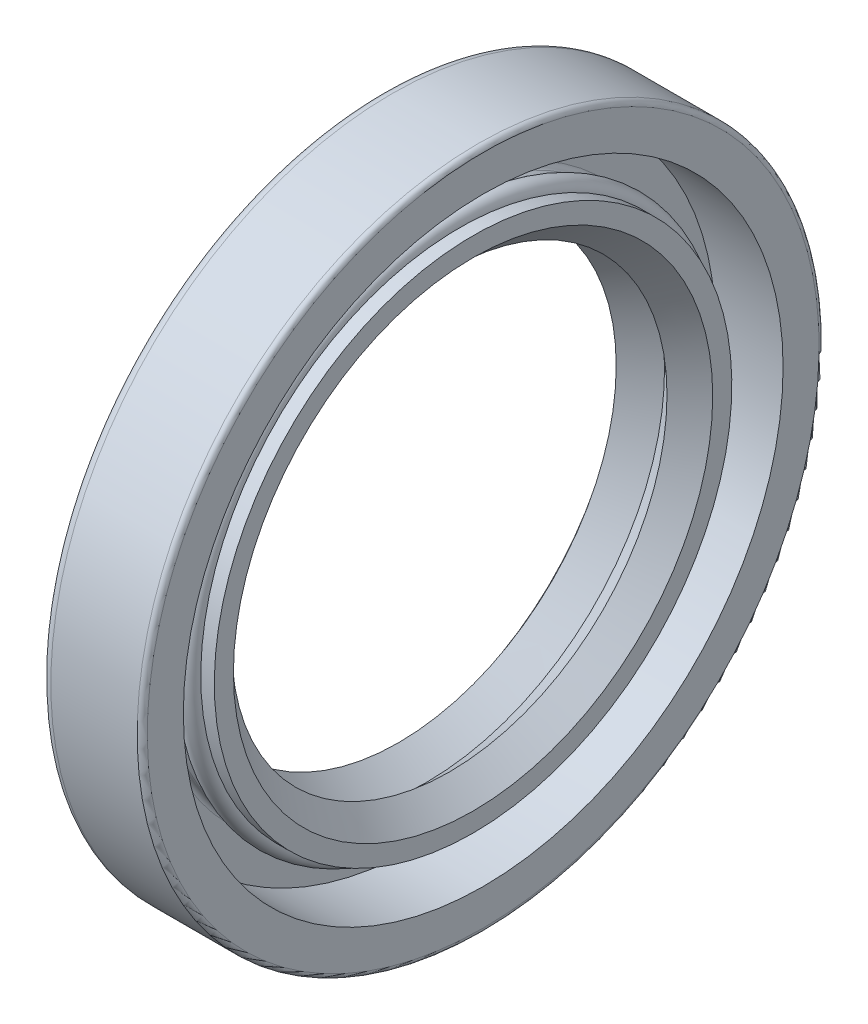
ISO-10303-21;
HEADER;
FILE_DESCRIPTION(('STEP AP214'),'2;1');
FILE_NAME('part.step','',(''),(''),'','','');
FILE_SCHEMA(('AUTOMOTIVE_DESIGN { 1 0 10303 214 1 1 1 1 }'));
ENDSEC;
DATA;
#1=APPLICATION_CONTEXT('core data for automotive mechanical design processes');
#2=APPLICATION_PROTOCOL_DEFINITION('international standard','automotive_design',2000,#1);
#3=PRODUCT_CONTEXT('',#1,'mechanical');
#4=PRODUCT('Part','Part','',(#3));
#5=PRODUCT_RELATED_PRODUCT_CATEGORY('part','',(#4));
#6=PRODUCT_DEFINITION_FORMATION('','',#4);
#7=PRODUCT_DEFINITION_CONTEXT('part definition',#1,'design');
#8=PRODUCT_DEFINITION('design','',#6,#7);
#9=PRODUCT_DEFINITION_SHAPE('','',#8);
#10=(LENGTH_UNIT() NAMED_UNIT(*) SI_UNIT(.MILLI.,.METRE.));
#11=(NAMED_UNIT(*) PLANE_ANGLE_UNIT() SI_UNIT($,.RADIAN.));
#12=(NAMED_UNIT(*) SI_UNIT($,.STERADIAN.) SOLID_ANGLE_UNIT());
#13=UNCERTAINTY_MEASURE_WITH_UNIT(LENGTH_MEASURE(1.E-05),#10,'distance_accuracy_value','');
#14=(GEOMETRIC_REPRESENTATION_CONTEXT(3) GLOBAL_UNCERTAINTY_ASSIGNED_CONTEXT((#13)) GLOBAL_UNIT_ASSIGNED_CONTEXT((#10,
#11,#12)) REPRESENTATION_CONTEXT('',''));
#15=CARTESIAN_POINT('',(0.,0.,0.));
#16=DIRECTION('',(0.,0.,1.));
#17=DIRECTION('',(1.,0.,0.));
#18=AXIS2_PLACEMENT_3D('',#15,#16,#17);
#19=CARTESIAN_POINT('',(4.66666666666667,0.,0.));
#20=DIRECTION('',(-1.,0.,0.));
#21=DIRECTION('',(0.,0.,1.));
#22=AXIS2_PLACEMENT_3D('',#19,#20,#21);
#23=TOROIDAL_SURFACE('',#22,17.8333333333333,0.699999999999999);
#24=CARTESIAN_POINT('',(4.66666666666667,0.,18.5333333333333));
#25=VERTEX_POINT('',#24);
#26=VERTEX_LOOP('',#25);
#27=FACE_BOUND('',#26,.T.);
#28=ADVANCED_FACE('F47',(#27),#23,.T.);
#29=CLOSED_SHELL('',(#28));
#30=MANIFOLD_SOLID_BREP('B2',#29);
#31=CARTESIAN_POINT('',(0.,22.8,0.));
#32=DIRECTION('',(1.,0.,0.));
#33=DIRECTION('',(0.,1.,0.));
#34=AXIS2_PLACEMENT_3D('',#31,#32,#33);
#35=PLANE('',#34);
#36=CARTESIAN_POINT('',(0.,0.,0.));
#37=DIRECTION('',(-1.,0.,0.));
#38=DIRECTION('',(0.,-1.,0.));
#39=AXIS2_PLACEMENT_3D('',#36,#37,#38);
#40=CIRCLE('',#39,20.6666666666667);
#41=CARTESIAN_POINT('',(0.,-20.6666666666667,0.));
#42=VERTEX_POINT('',#41);
#43=EDGE_CURVE('E46',#42,#42,#40,.T.);
#44=ORIENTED_EDGE('',*,*,#43,.F.);
#45=EDGE_LOOP('',(#44));
#46=FACE_BOUND('',#45,.T.);
#47=CARTESIAN_POINT('',(0.,0.,0.));
#48=DIRECTION('',(-1.,0.,0.));
#49=DIRECTION('',(0.,-1.,0.));
#50=AXIS2_PLACEMENT_3D('',#47,#48,#49);
#51=CIRCLE('',#50,22.8);
#52=CARTESIAN_POINT('',(0.,-22.8,0.));
#53=VERTEX_POINT('',#52);
#54=EDGE_CURVE('E153',#53,#53,#51,.T.);
#55=ORIENTED_EDGE('',*,*,#54,.T.);
#56=EDGE_LOOP('',(#55));
#57=FACE_BOUND('',#56,.T.);
#58=ADVANCED_FACE('F60',(#46,#57),#35,.F.);
#59=CARTESIAN_POINT('',(7.,0.,0.));
#60=DIRECTION('',(-1.,0.,0.));
#61=DIRECTION('',(0.,-1.,0.));
#62=AXIS2_PLACEMENT_3D('',#59,#60,#61);
#63=CYLINDRICAL_SURFACE('',#62,20.6666666666667);
#64=CARTESIAN_POINT('',(0.21875,0.,0.));
#65=DIRECTION('',(-1.,0.,0.));
#66=DIRECTION('',(0.,-1.,0.));
#67=AXIS2_PLACEMENT_3D('',#64,#65,#66);
#68=CIRCLE('',#67,20.6666666666667);
#69=CARTESIAN_POINT('',(0.21875,-20.6666666666667,0.));
#70=VERTEX_POINT('',#69);
#71=EDGE_CURVE('E67',#70,#70,#68,.T.);
#72=ORIENTED_EDGE('',*,*,#71,.F.);
#73=EDGE_LOOP('',(#72));
#74=FACE_BOUND('',#73,.T.);
#75=ORIENTED_EDGE('',*,*,#43,.T.);
#76=EDGE_LOOP('',(#75));
#77=FACE_BOUND('',#76,.T.);
#78=ADVANCED_FACE('F276',(#74,#77),#63,.F.);
#79=CARTESIAN_POINT('',(0.21875,20.6666666666667,0.));
#80=DIRECTION('',(1.,0.,0.));
#81=DIRECTION('',(0.,1.,0.));
#82=AXIS2_PLACEMENT_3D('',#79,#80,#81);
#83=PLANE('',#82);
#84=CARTESIAN_POINT('',(0.21875,0.,0.));
#85=DIRECTION('',(-1.,0.,0.));
#86=DIRECTION('',(0.,-1.,0.));
#87=AXIS2_PLACEMENT_3D('',#84,#85,#86);
#88=CIRCLE('',#87,17.8333333333333);
#89=CARTESIAN_POINT('',(0.21875,-17.8333333333333,0.));
#90=VERTEX_POINT('',#89);
#91=EDGE_CURVE('E73',#90,#90,#88,.T.);
#92=ORIENTED_EDGE('',*,*,#91,.F.);
#93=EDGE_LOOP('',(#92));
#94=FACE_BOUND('',#93,.T.);
#95=ORIENTED_EDGE('',*,*,#71,.T.);
#96=EDGE_LOOP('',(#95));
#97=FACE_BOUND('',#96,.T.);
#98=ADVANCED_FACE('F271',(#94,#97),#83,.F.);
#99=CARTESIAN_POINT('',(7.,0.,0.));
#100=DIRECTION('',(-1.,0.,0.));
#101=DIRECTION('',(0.,-1.,0.));
#102=AXIS2_PLACEMENT_3D('',#99,#100,#101);
#103=CYLINDRICAL_SURFACE('',#102,17.8333333333333);
#104=CARTESIAN_POINT('',(0.,0.,0.));
#105=DIRECTION('',(-1.,0.,0.));
#106=DIRECTION('',(0.,-1.,0.));
#107=AXIS2_PLACEMENT_3D('',#104,#105,#106);
#108=CIRCLE('',#107,17.8333333333333);
#109=CARTESIAN_POINT('',(0.,-17.8333333333333,0.));
#110=VERTEX_POINT('',#109);
#111=EDGE_CURVE('E79',#110,#110,#108,.T.);
#112=ORIENTED_EDGE('',*,*,#111,.F.);
#113=EDGE_LOOP('',(#112));
#114=FACE_BOUND('',#113,.T.);
#115=ORIENTED_EDGE('',*,*,#91,.T.);
#116=EDGE_LOOP('',(#115));
#117=FACE_BOUND('',#116,.T.);
#118=ADVANCED_FACE('F265',(#114,#117),#103,.T.);
#119=CARTESIAN_POINT('',(0.,17.8333333333333,0.));
#120=DIRECTION('',(1.,0.,0.));
#121=DIRECTION('',(0.,1.,0.));
#122=AXIS2_PLACEMENT_3D('',#119,#120,#121);
#123=PLANE('',#122);
#124=CARTESIAN_POINT('',(0.,0.,0.));
#125=DIRECTION('',(-1.,0.,0.));
#126=DIRECTION('',(0.,-1.,0.));
#127=AXIS2_PLACEMENT_3D('',#124,#125,#126);
#128=CIRCLE('',#127,17.125);
#129=CARTESIAN_POINT('',(0.,-17.125,0.));
#130=VERTEX_POINT('',#129);
#131=EDGE_CURVE('E85',#130,#130,#128,.T.);
#132=ORIENTED_EDGE('',*,*,#131,.F.);
#133=EDGE_LOOP('',(#132));
#134=FACE_BOUND('',#133,.T.);
#135=ORIENTED_EDGE('',*,*,#111,.T.);
#136=EDGE_LOOP('',(#135));
#137=FACE_BOUND('',#136,.T.);
#138=ADVANCED_FACE('F259',(#134,#137),#123,.F.);
#139=CARTESIAN_POINT('',(0.,0.,0.));
#140=DIRECTION('',(-1.,0.,0.));
#141=DIRECTION('',(0.,-1.,0.));
#142=AXIS2_PLACEMENT_3D('',#139,#140,#141);
#143=CONICAL_SURFACE('',#142,17.125,0.545655054526993);
#144=CARTESIAN_POINT('',(1.16666666666667,0.,0.));
#145=DIRECTION('',(-1.,0.,0.));
#146=DIRECTION('',(0.,-1.,0.));
#147=AXIS2_PLACEMENT_3D('',#144,#145,#146);
#148=CIRCLE('',#147,16.4166666666667);
#149=CARTESIAN_POINT('',(1.16666666666667,-16.4166666666667,0.));
#150=VERTEX_POINT('',#149);
#151=EDGE_CURVE('E89',#150,#150,#148,.T.);
#152=ORIENTED_EDGE('',*,*,#151,.F.);
#153=EDGE_LOOP('',(#152));
#154=FACE_BOUND('',#153,.T.);
#155=ORIENTED_EDGE('',*,*,#131,.T.);
#156=EDGE_LOOP('',(#155));
#157=FACE_BOUND('',#156,.T.);
#158=ADVANCED_FACE('F253',(#154,#157),#143,.F.);
#159=CARTESIAN_POINT('',(1.16666666666667,0.,0.));
#160=DIRECTION('',(1.,0.,0.));
#161=DIRECTION('',(0.,1.,0.));
#162=AXIS2_PLACEMENT_3D('',#159,#160,#161);
#163=CONICAL_SURFACE('',#162,16.4166666666667,0.637393208145611);
#164=CARTESIAN_POINT('',(0.489140143141471,0.,0.));
#165=DIRECTION('',(-1.,0.,0.));
#166=DIRECTION('',(0.,-1.,0.));
#167=AXIS2_PLACEMENT_3D('',#164,#165,#166);
#168=CIRCLE('',#167,15.914958406911);
#169=CARTESIAN_POINT('',(0.489140143141471,-15.914958406911,0.));
#170=VERTEX_POINT('',#169);
#171=EDGE_CURVE('E93',#170,#170,#168,.T.);
#172=ORIENTED_EDGE('',*,*,#171,.F.);
#173=EDGE_LOOP('',(#172));
#174=FACE_BOUND('',#173,.T.);
#175=ORIENTED_EDGE('',*,*,#151,.T.);
#176=EDGE_LOOP('',(#175));
#177=FACE_BOUND('',#176,.T.);
#178=ADVANCED_FACE('F247',(#174,#177),#163,.T.);
#179=CARTESIAN_POINT('',(0.489140143141471,0.,0.));
#180=DIRECTION('',(-1.,0.,0.));
#181=DIRECTION('',(0.,-1.,0.));
#182=AXIS2_PLACEMENT_3D('',#179,#180,#181);
#183=CONICAL_SURFACE('',#182,15.914958406911,0.933403118649285);
#184=CARTESIAN_POINT('',(1.16666666666667,0.,0.));
#185=DIRECTION('',(-1.,0.,0.));
#186=DIRECTION('',(0.,-1.,0.));
#187=AXIS2_PLACEMENT_3D('',#184,#185,#186);
#188=CIRCLE('',#187,15.);
#189=CARTESIAN_POINT('',(1.16666666666667,-15.,0.));
#190=VERTEX_POINT('',#189);
#191=EDGE_CURVE('E97',#190,#190,#188,.T.);
#192=ORIENTED_EDGE('',*,*,#191,.F.);
#193=EDGE_LOOP('',(#192));
#194=FACE_BOUND('',#193,.T.);
#195=ORIENTED_EDGE('',*,*,#171,.T.);
#196=EDGE_LOOP('',(#195));
#197=FACE_BOUND('',#196,.T.);
#198=ADVANCED_FACE('F241',(#194,#197),#183,.F.);
#199=CARTESIAN_POINT('',(1.16666666666667,0.,0.));
#200=DIRECTION('',(1.,0.,0.));
#201=DIRECTION('',(0.,1.,0.));
#202=AXIS2_PLACEMENT_3D('',#199,#200,#201);
#203=CONICAL_SURFACE('',#202,15.,0.637393208145611);
#204=CARTESIAN_POINT('',(3.07978893044627,0.,0.));
#205=DIRECTION('',(-1.,0.,0.));
#206=DIRECTION('',(0.,-1.,0.));
#207=AXIS2_PLACEMENT_3D('',#204,#205,#206);
#208=CIRCLE('',#207,16.4166666666667);
#209=CARTESIAN_POINT('',(3.07978893044627,-16.4166666666667,0.));
#210=VERTEX_POINT('',#209);
#211=EDGE_CURVE('E101',#210,#210,#208,.T.);
#212=ORIENTED_EDGE('',*,*,#211,.F.);
#213=EDGE_LOOP('',(#212));
#214=FACE_BOUND('',#213,.T.);
#215=ORIENTED_EDGE('',*,*,#191,.T.);
#216=EDGE_LOOP('',(#215));
#217=FACE_BOUND('',#216,.T.);
#218=ADVANCED_FACE('F235',(#214,#217),#203,.F.);
#219=CARTESIAN_POINT('',(3.07978893044627,0.,0.));
#220=DIRECTION('',(-1.,0.,0.));
#221=DIRECTION('',(0.,-1.,0.));
#222=AXIS2_PLACEMENT_3D('',#219,#220,#221);
#223=CONICAL_SURFACE('',#222,16.4166666666667,0.728788642685038);
#224=CARTESIAN_POINT('',(4.66666666666667,0.,0.));
#225=DIRECTION('',(-1.,0.,0.));
#226=DIRECTION('',(0.,-1.,0.));
#227=AXIS2_PLACEMENT_3D('',#224,#225,#226);
#228=CIRCLE('',#227,15.);
#229=CARTESIAN_POINT('',(4.66666666666667,-15.,0.));
#230=VERTEX_POINT('',#229);
#231=EDGE_CURVE('E105',#230,#230,#228,.T.);
#232=ORIENTED_EDGE('',*,*,#231,.F.);
#233=EDGE_LOOP('',(#232));
#234=FACE_BOUND('',#233,.T.);
#235=ORIENTED_EDGE('',*,*,#211,.T.);
#236=EDGE_LOOP('',(#235));
#237=FACE_BOUND('',#236,.T.);
#238=ADVANCED_FACE('F229',(#234,#237),#223,.F.);
#239=CARTESIAN_POINT('',(4.66666666666667,0.,0.));
#240=DIRECTION('',(1.,0.,0.));
#241=DIRECTION('',(0.,1.,0.));
#242=AXIS2_PLACEMENT_3D('',#239,#240,#241);
#243=CONICAL_SURFACE('',#242,15.,0.748378047523381);
#244=CARTESIAN_POINT('',(6.3,0.,0.));
#245=DIRECTION('',(-1.,0.,0.));
#246=DIRECTION('',(0.,-1.,0.));
#247=AXIS2_PLACEMENT_3D('',#244,#245,#246);
#248=CIRCLE('',#247,16.5166666666663);
#249=CARTESIAN_POINT('',(6.3,-16.5166666666663,0.));
#250=VERTEX_POINT('',#249);
#251=EDGE_CURVE('E109',#250,#250,#248,.T.);
#252=ORIENTED_EDGE('',*,*,#251,.F.);
#253=EDGE_LOOP('',(#252));
#254=FACE_BOUND('',#253,.T.);
#255=ORIENTED_EDGE('',*,*,#231,.T.);
#256=EDGE_LOOP('',(#255));
#257=FACE_BOUND('',#256,.T.);
#258=ADVANCED_FACE('F223',(#254,#257),#243,.F.);
#259=CARTESIAN_POINT('',(6.3,16.5166666666663,0.));
#260=DIRECTION('',(-1.,0.,0.));
#261=DIRECTION('',(0.,-1.,0.));
#262=AXIS2_PLACEMENT_3D('',#259,#260,#261);
#263=PLANE('',#262);
#264=CARTESIAN_POINT('',(6.3,0.,0.));
#265=DIRECTION('',(-1.,0.,0.));
#266=DIRECTION('',(0.,-1.,0.));
#267=AXIS2_PLACEMENT_3D('',#264,#265,#266);
#268=CIRCLE('',#267,17.8333333333333);
#269=CARTESIAN_POINT('',(6.3,-17.8333333333333,0.));
#270=VERTEX_POINT('',#269);
#271=EDGE_CURVE('E113',#270,#270,#268,.T.);
#272=ORIENTED_EDGE('',*,*,#271,.F.);
#273=EDGE_LOOP('',(#272));
#274=FACE_BOUND('',#273,.T.);
#275=ORIENTED_EDGE('',*,*,#251,.T.);
#276=EDGE_LOOP('',(#275));
#277=FACE_BOUND('',#276,.T.);
#278=ADVANCED_FACE('F217',(#274,#277),#263,.F.);
#279=CARTESIAN_POINT('',(7.,0.,0.));
#280=DIRECTION('',(-1.,0.,0.));
#281=DIRECTION('',(0.,-1.,0.));
#282=AXIS2_PLACEMENT_3D('',#279,#280,#281);
#283=CYLINDRICAL_SURFACE('',#282,17.8333333333333);
#284=CARTESIAN_POINT('',(5.36666666666667,0.,0.));
#285=DIRECTION('',(-1.,0.,0.));
#286=DIRECTION('',(0.,-1.,0.));
#287=AXIS2_PLACEMENT_3D('',#284,#285,#286);
#288=CIRCLE('',#287,17.8333333333333);
#289=CARTESIAN_POINT('',(5.36666666666667,-17.8333333333333,0.));
#290=VERTEX_POINT('',#289);
#291=EDGE_CURVE('E117',#290,#290,#288,.T.);
#292=ORIENTED_EDGE('',*,*,#291,.F.);
#293=EDGE_LOOP('',(#292));
#294=FACE_BOUND('',#293,.T.);
#295=ORIENTED_EDGE('',*,*,#271,.T.);
#296=EDGE_LOOP('',(#295));
#297=FACE_BOUND('',#296,.T.);
#298=ADVANCED_FACE('F211',(#294,#297),#283,.T.);
#299=CARTESIAN_POINT('',(4.66666666666667,0.,0.));
#300=DIRECTION('',(-1.,0.,0.));
#301=DIRECTION('',(0.,-1.,0.));
#302=AXIS2_PLACEMENT_3D('',#299,#300,#301);
#303=TOROIDAL_SURFACE('',#302,17.8333333333333,0.699999999999999);
#304=CARTESIAN_POINT('',(3.96666666666667,0.,0.));
#305=DIRECTION('',(-1.,0.,0.));
#306=DIRECTION('',(0.,-1.,0.));
#307=AXIS2_PLACEMENT_3D('',#304,#305,#306);
#308=CIRCLE('',#307,17.8333333333333);
#309=CARTESIAN_POINT('',(3.96666666666667,-17.8333333333333,0.));
#310=VERTEX_POINT('',#309);
#311=EDGE_CURVE('E121',#310,#310,#308,.T.);
#312=ORIENTED_EDGE('',*,*,#311,.F.);
#313=EDGE_LOOP('',(#312));
#314=FACE_BOUND('',#313,.T.);
#315=ORIENTED_EDGE('',*,*,#291,.T.);
#316=EDGE_LOOP('',(#315));
#317=FACE_BOUND('',#316,.T.);
#318=ADVANCED_FACE('F205',(#314,#317),#303,.F.);
#319=CARTESIAN_POINT('',(7.,0.,0.));
#320=DIRECTION('',(-1.,0.,0.));
#321=DIRECTION('',(0.,-1.,0.));
#322=AXIS2_PLACEMENT_3D('',#319,#320,#321);
#323=CYLINDRICAL_SURFACE('',#322,17.8333333333333);
#324=CARTESIAN_POINT('',(2.68333333333333,0.,0.));
#325=DIRECTION('',(-1.,0.,0.));
#326=DIRECTION('',(0.,-1.,0.));
#327=AXIS2_PLACEMENT_3D('',#324,#325,#326);
#328=CIRCLE('',#327,17.8333333333333);
#329=CARTESIAN_POINT('',(2.68333333333333,-17.8333333333333,0.));
#330=VERTEX_POINT('',#329);
#331=EDGE_CURVE('E125',#330,#330,#328,.T.);
#332=ORIENTED_EDGE('',*,*,#331,.F.);
#333=EDGE_LOOP('',(#332));
#334=FACE_BOUND('',#333,.T.);
#335=ORIENTED_EDGE('',*,*,#311,.T.);
#336=EDGE_LOOP('',(#335));
#337=FACE_BOUND('',#336,.T.);
#338=ADVANCED_FACE('F199',(#334,#337),#323,.T.);
#339=CARTESIAN_POINT('',(2.68333333333333,0.,0.));
#340=DIRECTION('',(-1.,0.,0.));
#341=DIRECTION('',(0.,-1.,0.));
#342=AXIS2_PLACEMENT_3D('',#339,#340,#341);
#343=TOROIDAL_SURFACE('',#342,18.1833333333333,0.35);
#344=CARTESIAN_POINT('',(2.33333333333333,0.,0.));
#345=DIRECTION('',(-1.,0.,0.));
#346=DIRECTION('',(0.,-1.,0.));
#347=AXIS2_PLACEMENT_3D('',#344,#345,#346);
#348=CIRCLE('',#347,18.1833333333333);
#349=CARTESIAN_POINT('',(2.33333333333333,-18.1833333333333,0.));
#350=VERTEX_POINT('',#349);
#351=EDGE_CURVE('E129',#350,#350,#348,.T.);
#352=ORIENTED_EDGE('',*,*,#351,.F.);
#353=EDGE_LOOP('',(#352));
#354=FACE_BOUND('',#353,.T.);
#355=ORIENTED_EDGE('',*,*,#331,.T.);
#356=EDGE_LOOP('',(#355));
#357=FACE_BOUND('',#356,.T.);
#358=ADVANCED_FACE('F193',(#354,#357),#343,.F.);
#359=CARTESIAN_POINT('',(2.33333333333333,18.1833333333333,0.));
#360=DIRECTION('',(-1.,0.,0.));
#361=DIRECTION('',(0.,-1.,0.));
#362=AXIS2_PLACEMENT_3D('',#359,#360,#361);
#363=PLANE('',#362);
#364=CARTESIAN_POINT('',(2.33333333333333,0.,0.));
#365=DIRECTION('',(-1.,0.,0.));
#366=DIRECTION('',(0.,-1.,0.));
#367=AXIS2_PLACEMENT_3D('',#364,#365,#366);
#368=CIRCLE('',#367,20.6666666666667);
#369=CARTESIAN_POINT('',(2.33333333333333,-20.6666666666667,0.));
#370=VERTEX_POINT('',#369);
#371=EDGE_CURVE('E133',#370,#370,#368,.T.);
#372=ORIENTED_EDGE('',*,*,#371,.F.);
#373=EDGE_LOOP('',(#372));
#374=FACE_BOUND('',#373,.T.);
#375=ORIENTED_EDGE('',*,*,#351,.T.);
#376=EDGE_LOOP('',(#375));
#377=FACE_BOUND('',#376,.T.);
#378=ADVANCED_FACE('F187',(#374,#377),#363,.F.);
#379=CARTESIAN_POINT('',(7.,0.,0.));
#380=DIRECTION('',(-1.,0.,0.));
#381=DIRECTION('',(0.,-1.,0.));
#382=AXIS2_PLACEMENT_3D('',#379,#380,#381);
#383=CYLINDRICAL_SURFACE('',#382,20.6666666666667);
#384=CARTESIAN_POINT('',(7.,0.,0.));
#385=DIRECTION('',(-1.,0.,0.));
#386=DIRECTION('',(0.,-1.,0.));
#387=AXIS2_PLACEMENT_3D('',#384,#385,#386);
#388=CIRCLE('',#387,20.6666666666667);
#389=CARTESIAN_POINT('',(7.,-20.6666666666667,0.));
#390=VERTEX_POINT('',#389);
#391=EDGE_CURVE('E137',#390,#390,#388,.T.);
#392=ORIENTED_EDGE('',*,*,#391,.F.);
#393=EDGE_LOOP('',(#392));
#394=FACE_BOUND('',#393,.T.);
#395=ORIENTED_EDGE('',*,*,#371,.T.);
#396=EDGE_LOOP('',(#395));
#397=FACE_BOUND('',#396,.T.);
#398=ADVANCED_FACE('F181',(#394,#397),#383,.F.);
#399=CARTESIAN_POINT('',(7.,20.6666666666667,0.));
#400=DIRECTION('',(-1.,0.,0.));
#401=DIRECTION('',(0.,-1.,0.));
#402=AXIS2_PLACEMENT_3D('',#399,#400,#401);
#403=PLANE('',#402);
#404=CARTESIAN_POINT('',(7.,0.,0.));
#405=DIRECTION('',(-1.,0.,0.));
#406=DIRECTION('',(0.,-1.,0.));
#407=AXIS2_PLACEMENT_3D('',#404,#405,#406);
#408=CIRCLE('',#407,23.15);
#409=CARTESIAN_POINT('',(7.,-23.15,0.));
#410=VERTEX_POINT('',#409);
#411=EDGE_CURVE('E141',#410,#410,#408,.T.);
#412=ORIENTED_EDGE('',*,*,#411,.F.);
#413=EDGE_LOOP('',(#412));
#414=FACE_BOUND('',#413,.T.);
#415=ORIENTED_EDGE('',*,*,#391,.T.);
#416=EDGE_LOOP('',(#415));
#417=FACE_BOUND('',#416,.T.);
#418=ADVANCED_FACE('F175',(#414,#417),#403,.F.);
#419=CARTESIAN_POINT('',(6.65,0.,0.));
#420=DIRECTION('',(-1.,0.,0.));
#421=DIRECTION('',(0.,-1.,0.));
#422=AXIS2_PLACEMENT_3D('',#419,#420,#421);
#423=TOROIDAL_SURFACE('',#422,23.15,0.35);
#424=CARTESIAN_POINT('',(6.65,0.,0.));
#425=DIRECTION('',(-1.,0.,0.));
#426=DIRECTION('',(0.,-1.,0.));
#427=AXIS2_PLACEMENT_3D('',#424,#425,#426);
#428=CIRCLE('',#427,23.5);
#429=CARTESIAN_POINT('',(6.65,-23.5,0.));
#430=VERTEX_POINT('',#429);
#431=EDGE_CURVE('E145',#430,#430,#428,.T.);
#432=ORIENTED_EDGE('',*,*,#431,.F.);
#433=EDGE_LOOP('',(#432));
#434=FACE_BOUND('',#433,.T.);
#435=ORIENTED_EDGE('',*,*,#411,.T.);
#436=EDGE_LOOP('',(#435));
#437=FACE_BOUND('',#436,.T.);
#438=ADVANCED_FACE('F169',(#434,#437),#423,.T.);
#439=CARTESIAN_POINT('',(7.,0.,0.));
#440=DIRECTION('',(-1.,0.,0.));
#441=DIRECTION('',(0.,-1.,0.));
#442=AXIS2_PLACEMENT_3D('',#439,#440,#441);
#443=CYLINDRICAL_SURFACE('',#442,23.5);
#444=CARTESIAN_POINT('',(0.699999999999999,0.,0.));
#445=DIRECTION('',(-1.,0.,0.));
#446=DIRECTION('',(0.,-1.,0.));
#447=AXIS2_PLACEMENT_3D('',#444,#445,#446);
#448=CIRCLE('',#447,23.5);
#449=CARTESIAN_POINT('',(0.699999999999999,-23.5,0.));
#450=VERTEX_POINT('',#449);
#451=EDGE_CURVE('E149',#450,#450,#448,.T.);
#452=ORIENTED_EDGE('',*,*,#451,.F.);
#453=EDGE_LOOP('',(#452));
#454=FACE_BOUND('',#453,.T.);
#455=ORIENTED_EDGE('',*,*,#431,.T.);
#456=EDGE_LOOP('',(#455));
#457=FACE_BOUND('',#456,.T.);
#458=ADVANCED_FACE('F163',(#454,#457),#443,.T.);
#459=CARTESIAN_POINT('',(0.699999999999999,0.,0.));
#460=DIRECTION('',(-1.,0.,0.));
#461=DIRECTION('',(0.,-1.,0.));
#462=AXIS2_PLACEMENT_3D('',#459,#460,#461);
#463=TOROIDAL_SURFACE('',#462,22.8,0.699999999999999);
#464=ORIENTED_EDGE('',*,*,#54,.F.);
#465=EDGE_LOOP('',(#464));
#466=FACE_BOUND('',#465,.T.);
#467=ORIENTED_EDGE('',*,*,#451,.T.);
#468=EDGE_LOOP('',(#467));
#469=FACE_BOUND('',#468,.T.);
#470=ADVANCED_FACE('F160',(#466,#469),#463,.T.);
#471=CLOSED_SHELL('',(#58,#78,#98,#118,#138,#158,#178,#198,#218,#238,#258,#278,#298,#318,#338,
#358,#378,#398,#418,#438,#458,#470));
#472=MANIFOLD_SOLID_BREP('B6',#471);
#473=ADVANCED_BREP_SHAPE_REPRESENTATION('',(#18,#30,#472),#14);
#474=SHAPE_DEFINITION_REPRESENTATION(#9,#473);
ENDSEC;
END-ISO-10303-21;
